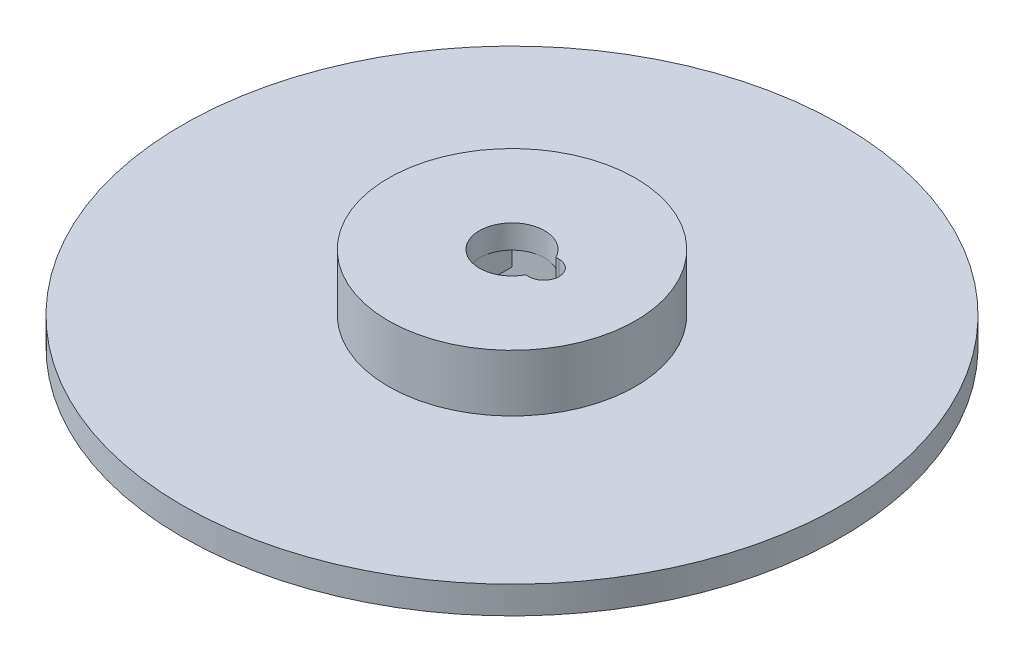
ISO-10303-21;
HEADER;
FILE_DESCRIPTION(('STEP AP214'),'2;1');
FILE_NAME('part.step','',(''),(''),'','','');
FILE_SCHEMA(('AUTOMOTIVE_DESIGN { 1 0 10303 214 1 1 1 1 }'));
ENDSEC;
DATA;
#1=APPLICATION_CONTEXT('core data for automotive mechanical design processes');
#2=APPLICATION_PROTOCOL_DEFINITION('international standard','automotive_design',2000,#1);
#3=PRODUCT_CONTEXT('',#1,'mechanical');
#4=PRODUCT('Part','Part','',(#3));
#5=PRODUCT_RELATED_PRODUCT_CATEGORY('part','',(#4));
#6=PRODUCT_DEFINITION_FORMATION('','',#4);
#7=PRODUCT_DEFINITION_CONTEXT('part definition',#1,'design');
#8=PRODUCT_DEFINITION('design','',#6,#7);
#9=PRODUCT_DEFINITION_SHAPE('','',#8);
#10=(LENGTH_UNIT() NAMED_UNIT(*) SI_UNIT(.MILLI.,.METRE.));
#11=(NAMED_UNIT(*) PLANE_ANGLE_UNIT() SI_UNIT($,.RADIAN.));
#12=(NAMED_UNIT(*) SI_UNIT($,.STERADIAN.) SOLID_ANGLE_UNIT());
#13=UNCERTAINTY_MEASURE_WITH_UNIT(LENGTH_MEASURE(1.E-05),#10,'distance_accuracy_value','');
#14=(GEOMETRIC_REPRESENTATION_CONTEXT(3) GLOBAL_UNCERTAINTY_ASSIGNED_CONTEXT((#13)) GLOBAL_UNIT_ASSIGNED_CONTEXT((#10,
#11,#12)) REPRESENTATION_CONTEXT('',''));
#15=CARTESIAN_POINT('',(0.,0.,0.));
#16=DIRECTION('',(0.,0.,1.));
#17=DIRECTION('',(1.,0.,0.));
#18=AXIS2_PLACEMENT_3D('',#15,#16,#17);
#19=CARTESIAN_POINT('',(0.,0.,0.));
#20=DIRECTION('',(0.,1.,0.));
#21=DIRECTION('',(0.,0.,1.));
#22=AXIS2_PLACEMENT_3D('',#19,#20,#21);
#23=PLANE('',#22);
#24=CARTESIAN_POINT('',(0.,0.,0.));
#25=DIRECTION('',(0.,1.,0.));
#26=DIRECTION('',(0.,0.,1.));
#27=AXIS2_PLACEMENT_3D('',#24,#25,#26);
#28=CIRCLE('',#27,60.);
#29=CARTESIAN_POINT('',(0.,0.,60.));
#30=VERTEX_POINT('',#29);
#31=EDGE_CURVE('E233',#30,#30,#28,.T.);
#32=ORIENTED_EDGE('',*,*,#31,.F.);
#33=EDGE_LOOP('',(#32));
#34=FACE_BOUND('',#33,.T.);
#35=DIRECTION('',(1.,0.,0.));
#36=VECTOR('',#35,1.);
#37=CARTESIAN_POINT('',(-10.73,0.,-5.925));
#38=LINE('',#37,#36);
#39=CARTESIAN_POINT('',(-10.73,0.,-5.925));
#40=VERTEX_POINT('',#39);
#41=CARTESIAN_POINT('',(21.37,0.,-5.925));
#42=VERTEX_POINT('',#41);
#43=EDGE_CURVE('E141',#40,#42,#38,.T.);
#44=ORIENTED_EDGE('',*,*,#43,.F.);
#45=DIRECTION('',(0.,0.,1.));
#46=VECTOR('',#45,1.);
#47=CARTESIAN_POINT('',(-10.73,0.,-5.925));
#48=LINE('',#47,#46);
#49=CARTESIAN_POINT('',(-10.73,0.,5.925));
#50=VERTEX_POINT('',#49);
#51=EDGE_CURVE('E166',#40,#50,#48,.T.);
#52=ORIENTED_EDGE('',*,*,#51,.T.);
#53=DIRECTION('',(1.,0.,0.));
#54=VECTOR('',#53,1.);
#55=CARTESIAN_POINT('',(-10.73,0.,5.925));
#56=LINE('',#55,#54);
#57=CARTESIAN_POINT('',(21.37,0.,5.925));
#58=VERTEX_POINT('',#57);
#59=EDGE_CURVE('E51',#50,#58,#56,.T.);
#60=ORIENTED_EDGE('',*,*,#59,.T.);
#61=DIRECTION('',(0.,0.,1.));
#62=VECTOR('',#61,1.);
#63=CARTESIAN_POINT('',(21.37,0.,-5.925));
#64=LINE('',#63,#62);
#65=EDGE_CURVE('E153',#42,#58,#64,.T.);
#66=ORIENTED_EDGE('',*,*,#65,.F.);
#67=EDGE_LOOP('',(#44,#52,#60,#66));
#68=FACE_BOUND('',#67,.T.);
#69=ADVANCED_FACE('F33',(#34,#68),#23,.F.);
#70=CARTESIAN_POINT('',(0.,16.7,0.));
#71=DIRECTION('',(0.,-1.,0.));
#72=DIRECTION('',(0.,0.,-1.));
#73=AXIS2_PLACEMENT_3D('',#70,#71,#72);
#74=CYLINDRICAL_SURFACE('',#73,22.5);
#75=CARTESIAN_POINT('',(0.,5.,0.));
#76=DIRECTION('',(0.,1.,0.));
#77=DIRECTION('',(0.,0.,1.));
#78=AXIS2_PLACEMENT_3D('',#75,#76,#77);
#79=CIRCLE('',#78,22.5);
#80=CARTESIAN_POINT('',(0.,5.,22.5));
#81=VERTEX_POINT('',#80);
#82=EDGE_CURVE('E234',#81,#81,#79,.T.);
#83=ORIENTED_EDGE('',*,*,#82,.T.);
#84=EDGE_LOOP('',(#83));
#85=FACE_BOUND('',#84,.T.);
#86=CARTESIAN_POINT('',(0.,15.36,0.));
#87=DIRECTION('',(0.,1.,0.));
#88=DIRECTION('',(0.,0.,1.));
#89=AXIS2_PLACEMENT_3D('',#86,#87,#88);
#90=CIRCLE('',#89,22.5);
#91=CARTESIAN_POINT('',(0.,15.36,22.5));
#92=VERTEX_POINT('',#91);
#93=EDGE_CURVE('E224',#92,#92,#90,.T.);
#94=ORIENTED_EDGE('',*,*,#93,.F.);
#95=EDGE_LOOP('',(#94));
#96=FACE_BOUND('',#95,.T.);
#97=ADVANCED_FACE('F289',(#85,#96),#74,.T.);
#98=CARTESIAN_POINT('',(0.,5.,0.));
#99=DIRECTION('',(0.,-1.,0.));
#100=DIRECTION('',(0.,0.,-1.));
#101=AXIS2_PLACEMENT_3D('',#98,#99,#100);
#102=CYLINDRICAL_SURFACE('',#101,60.);
#103=CARTESIAN_POINT('',(0.,5.,0.));
#104=DIRECTION('',(0.,1.,0.));
#105=DIRECTION('',(0.,0.,1.));
#106=AXIS2_PLACEMENT_3D('',#103,#104,#105);
#107=CIRCLE('',#106,60.);
#108=CARTESIAN_POINT('',(0.,5.,60.));
#109=VERTEX_POINT('',#108);
#110=EDGE_CURVE('E237',#109,#109,#107,.T.);
#111=ORIENTED_EDGE('',*,*,#110,.F.);
#112=EDGE_LOOP('',(#111));
#113=FACE_BOUND('',#112,.T.);
#114=ORIENTED_EDGE('',*,*,#31,.T.);
#115=EDGE_LOOP('',(#114));
#116=FACE_BOUND('',#115,.T.);
#117=ADVANCED_FACE('F35',(#113,#116),#102,.T.);
#118=CARTESIAN_POINT('',(0.,5.,0.));
#119=DIRECTION('',(0.,1.,0.));
#120=DIRECTION('',(0.,0.,1.));
#121=AXIS2_PLACEMENT_3D('',#118,#119,#120);
#122=PLANE('',#121);
#123=ORIENTED_EDGE('',*,*,#82,.F.);
#124=EDGE_LOOP('',(#123));
#125=FACE_BOUND('',#124,.T.);
#126=ORIENTED_EDGE('',*,*,#110,.T.);
#127=EDGE_LOOP('',(#126));
#128=FACE_BOUND('',#127,.T.);
#129=ADVANCED_FACE('F287',(#125,#128),#122,.T.);
#130=CARTESIAN_POINT('',(0.,15.36,0.));
#131=DIRECTION('',(0.,1.,0.));
#132=DIRECTION('',(0.,0.,1.));
#133=AXIS2_PLACEMENT_3D('',#130,#131,#132);
#134=PLANE('',#133);
#135=CARTESIAN_POINT('',(5.82,15.36,0.));
#136=DIRECTION('',(0.,1.,0.));
#137=DIRECTION('',(0.,0.,1.));
#138=AXIS2_PLACEMENT_3D('',#135,#136,#137);
#139=CIRCLE('',#138,2.75);
#140=CARTESIAN_POINT('',(5.82,15.36,2.75));
#141=VERTEX_POINT('',#140);
#142=CARTESIAN_POINT('',(5.82,15.36,-2.75));
#143=VERTEX_POINT('',#142);
#144=EDGE_CURVE('E211',#141,#143,#139,.T.);
#145=ORIENTED_EDGE('',*,*,#144,.F.);
#146=DIRECTION('',(1.,0.,0.));
#147=VECTOR('',#146,1.);
#148=CARTESIAN_POINT('',(5.25379862575642,15.36,2.75));
#149=LINE('',#148,#147);
#150=CARTESIAN_POINT('',(5.25379862575642,15.36,2.75));
#151=VERTEX_POINT('',#150);
#152=EDGE_CURVE('E204',#151,#141,#149,.T.);
#153=ORIENTED_EDGE('',*,*,#152,.F.);
#154=CARTESIAN_POINT('',(0.,15.36,0.));
#155=DIRECTION('',(0.,1.,0.));
#156=DIRECTION('',(0.,0.,1.));
#157=AXIS2_PLACEMENT_3D('',#154,#155,#156);
#158=CIRCLE('',#157,5.93);
#159=CARTESIAN_POINT('',(5.25379862575642,15.36,-2.75));
#160=VERTEX_POINT('',#159);
#161=EDGE_CURVE('E217',#160,#151,#158,.T.);
#162=ORIENTED_EDGE('',*,*,#161,.F.);
#163=DIRECTION('',(-1.,0.,0.));
#164=VECTOR('',#163,1.);
#165=CARTESIAN_POINT('',(5.25379862575642,15.36,-2.75));
#166=LINE('',#165,#164);
#167=EDGE_CURVE('E213',#143,#160,#166,.T.);
#168=ORIENTED_EDGE('',*,*,#167,.F.);
#169=EDGE_LOOP('',(#145,#153,#162,#168));
#170=FACE_BOUND('',#169,.T.);
#171=ORIENTED_EDGE('',*,*,#93,.T.);
#172=EDGE_LOOP('',(#171));
#173=FACE_BOUND('',#172,.T.);
#174=ADVANCED_FACE('F283',(#170,#173),#134,.T.);
#175=CARTESIAN_POINT('',(5.82,11.06,0.));
#176=DIRECTION('',(0.,1.,0.));
#177=DIRECTION('',(0.,0.,1.));
#178=AXIS2_PLACEMENT_3D('',#175,#176,#177);
#179=CYLINDRICAL_SURFACE('',#178,2.75);
#180=ORIENTED_EDGE('',*,*,#144,.T.);
#181=DIRECTION('',(0.,1.,0.));
#182=VECTOR('',#181,1.);
#183=CARTESIAN_POINT('',(5.82,11.06,-2.75));
#184=LINE('',#183,#182);
#185=CARTESIAN_POINT('',(5.82,11.06,-2.75));
#186=VERTEX_POINT('',#185);
#187=EDGE_CURVE('E209',#186,#143,#184,.T.);
#188=ORIENTED_EDGE('',*,*,#187,.F.);
#189=CARTESIAN_POINT('',(5.82,11.06,0.));
#190=DIRECTION('',(0.,1.,0.));
#191=DIRECTION('',(0.,0.,1.));
#192=AXIS2_PLACEMENT_3D('',#189,#190,#191);
#193=CIRCLE('',#192,2.75);
#194=CARTESIAN_POINT('',(5.82,11.06,2.75));
#195=VERTEX_POINT('',#194);
#196=EDGE_CURVE('E201',#195,#186,#193,.T.);
#197=ORIENTED_EDGE('',*,*,#196,.F.);
#198=DIRECTION('',(0.,1.,0.));
#199=VECTOR('',#198,1.);
#200=CARTESIAN_POINT('',(5.82,11.06,2.75));
#201=LINE('',#200,#199);
#202=EDGE_CURVE('E222',#195,#141,#201,.T.);
#203=ORIENTED_EDGE('',*,*,#202,.T.);
#204=EDGE_LOOP('',(#180,#188,#197,#203));
#205=FACE_BOUND('',#204,.T.);
#206=ADVANCED_FACE('F280',(#205),#179,.F.);
#207=CARTESIAN_POINT('',(5.25379862575642,11.06,2.75));
#208=DIRECTION('',(0.,0.,1.));
#209=DIRECTION('',(1.,0.,0.));
#210=AXIS2_PLACEMENT_3D('',#207,#208,#209);
#211=PLANE('',#210);
#212=ORIENTED_EDGE('',*,*,#152,.T.);
#213=ORIENTED_EDGE('',*,*,#202,.F.);
#214=DIRECTION('',(1.,0.,0.));
#215=VECTOR('',#214,1.);
#216=CARTESIAN_POINT('',(5.25379862575642,11.06,2.75));
#217=LINE('',#216,#215);
#218=CARTESIAN_POINT('',(5.25379862575642,11.06,2.75));
#219=VERTEX_POINT('',#218);
#220=EDGE_CURVE('E207',#219,#195,#217,.T.);
#221=ORIENTED_EDGE('',*,*,#220,.F.);
#222=DIRECTION('',(0.,1.,0.));
#223=VECTOR('',#222,1.);
#224=CARTESIAN_POINT('',(5.25379862575642,11.06,2.75));
#225=LINE('',#224,#223);
#226=EDGE_CURVE('E225',#219,#151,#225,.T.);
#227=ORIENTED_EDGE('',*,*,#226,.T.);
#228=EDGE_LOOP('',(#212,#213,#221,#227));
#229=FACE_BOUND('',#228,.T.);
#230=ADVANCED_FACE('F272',(#229),#211,.F.);
#231=CARTESIAN_POINT('',(0.,11.06,0.));
#232=DIRECTION('',(0.,1.,0.));
#233=DIRECTION('',(0.,0.,1.));
#234=AXIS2_PLACEMENT_3D('',#231,#232,#233);
#235=CYLINDRICAL_SURFACE('',#234,5.93);
#236=ORIENTED_EDGE('',*,*,#161,.T.);
#237=ORIENTED_EDGE('',*,*,#226,.F.);
#238=CARTESIAN_POINT('',(0.,11.06,0.));
#239=DIRECTION('',(0.,1.,0.));
#240=DIRECTION('',(0.,0.,1.));
#241=AXIS2_PLACEMENT_3D('',#238,#239,#240);
#242=CIRCLE('',#241,5.93);
#243=CARTESIAN_POINT('',(0.243464576478782,11.06,5.925));
#244=VERTEX_POINT('',#243);
#245=EDGE_CURVE('E206',#244,#219,#242,.T.);
#246=ORIENTED_EDGE('',*,*,#245,.F.);
#247=CARTESIAN_POINT('',(-0.243464576478782,11.06,5.925));
#248=DIRECTION('',(1.,0.,0.));
#249=VECTOR('',#248,1.);
#250=LINE('',#247,#249);
#251=CARTESIAN_POINT('',(-0.243464576478782,11.06,5.925));
#252=VERTEX_POINT('',#251);
#253=EDGE_CURVE('E44',#252,#244,#250,.T.);
#254=ORIENTED_EDGE('',*,*,#253,.F.);
#255=CARTESIAN_POINT('',(-5.93,11.06,0.));
#256=VERTEX_POINT('',#255);
#257=EDGE_CURVE('E242',#256,#252,#242,.T.);
#258=ORIENTED_EDGE('',*,*,#257,.F.);
#259=CARTESIAN_POINT('',(-0.243464576478782,11.06,-5.925));
#260=VERTEX_POINT('',#259);
#261=EDGE_CURVE('E245',#260,#256,#242,.T.);
#262=ORIENTED_EDGE('',*,*,#261,.F.);
#263=CARTESIAN_POINT('',(0.243464576478782,11.06,-5.925));
#264=DIRECTION('',(-1.,0.,0.));
#265=VECTOR('',#264,1.);
#266=LINE('',#263,#265);
#267=CARTESIAN_POINT('',(0.243464576478782,11.06,-5.925));
#268=VERTEX_POINT('',#267);
#269=EDGE_CURVE('E11',#268,#260,#266,.T.);
#270=ORIENTED_EDGE('',*,*,#269,.F.);
#271=CARTESIAN_POINT('',(5.25379862575642,11.06,-2.75));
#272=VERTEX_POINT('',#271);
#273=EDGE_CURVE('E210',#272,#268,#242,.T.);
#274=ORIENTED_EDGE('',*,*,#273,.F.);
#275=DIRECTION('',(0.,1.,0.));
#276=VECTOR('',#275,1.);
#277=CARTESIAN_POINT('',(5.25379862575642,11.06,-2.75));
#278=LINE('',#277,#276);
#279=EDGE_CURVE('E227',#272,#160,#278,.T.);
#280=ORIENTED_EDGE('',*,*,#279,.T.);
#281=EDGE_LOOP('',(#236,#237,#246,#254,#258,#262,#270,#274,#280));
#282=FACE_BOUND('',#281,.T.);
#283=ADVANCED_FACE('F261',(#282),#235,.F.);
#284=CARTESIAN_POINT('',(5.25379862575642,11.06,-2.75));
#285=DIRECTION('',(0.,0.,-1.));
#286=DIRECTION('',(-1.,0.,0.));
#287=AXIS2_PLACEMENT_3D('',#284,#285,#286);
#288=PLANE('',#287);
#289=ORIENTED_EDGE('',*,*,#167,.T.);
#290=ORIENTED_EDGE('',*,*,#279,.F.);
#291=DIRECTION('',(-1.,0.,0.));
#292=VECTOR('',#291,1.);
#293=CARTESIAN_POINT('',(5.25379862575642,11.06,-2.75));
#294=LINE('',#293,#292);
#295=EDGE_CURVE('E203',#186,#272,#294,.T.);
#296=ORIENTED_EDGE('',*,*,#295,.F.);
#297=ORIENTED_EDGE('',*,*,#187,.T.);
#298=EDGE_LOOP('',(#289,#290,#296,#297));
#299=FACE_BOUND('',#298,.T.);
#300=ADVANCED_FACE('F271',(#299),#288,.F.);
#301=CARTESIAN_POINT('',(0.,11.06,0.));
#302=DIRECTION('',(0.,1.,0.));
#303=DIRECTION('',(0.,0.,1.));
#304=AXIS2_PLACEMENT_3D('',#301,#302,#303);
#305=PLANE('',#304);
#306=ORIENTED_EDGE('',*,*,#261,.T.);
#307=DIRECTION('',(0.,0.,1.));
#308=VECTOR('',#307,1.);
#309=CARTESIAN_POINT('',(-5.93,11.06,0.));
#310=LINE('',#309,#308);
#311=CARTESIAN_POINT('',(-5.93,11.06,-5.925));
#312=VERTEX_POINT('',#311);
#313=EDGE_CURVE('E193',#312,#256,#310,.T.);
#314=ORIENTED_EDGE('',*,*,#313,.F.);
#315=DIRECTION('',(1.,0.,0.));
#316=VECTOR('',#315,1.);
#317=CARTESIAN_POINT('',(0.,11.06,-5.925));
#318=LINE('',#317,#316);
#319=EDGE_CURVE('E197',#312,#260,#318,.T.);
#320=ORIENTED_EDGE('',*,*,#319,.T.);
#321=EDGE_LOOP('',(#306,#314,#320));
#322=FACE_BOUND('',#321,.T.);
#323=ADVANCED_FACE('F278',(#322),#305,.F.);
#324=ORIENTED_EDGE('',*,*,#257,.T.);
#325=DIRECTION('',(1.,0.,0.));
#326=VECTOR('',#325,1.);
#327=CARTESIAN_POINT('',(0.,11.06,5.925));
#328=LINE('',#327,#326);
#329=CARTESIAN_POINT('',(-5.93,11.06,5.925));
#330=VERTEX_POINT('',#329);
#331=EDGE_CURVE('E58',#330,#252,#328,.T.);
#332=ORIENTED_EDGE('',*,*,#331,.F.);
#333=EDGE_CURVE('E517',#256,#330,#310,.T.);
#334=ORIENTED_EDGE('',*,*,#333,.F.);
#335=EDGE_LOOP('',(#324,#332,#334));
#336=FACE_BOUND('',#335,.T.);
#337=ADVANCED_FACE('F352',(#336),#305,.F.);
#338=CARTESIAN_POINT('',(0.,6.66,-5.925));
#339=DIRECTION('',(0.,0.,1.));
#340=DIRECTION('',(1.,0.,0.));
#341=AXIS2_PLACEMENT_3D('',#338,#339,#340);
#342=PLANE('',#341);
#343=ORIENTED_EDGE('',*,*,#319,.F.);
#344=DIRECTION('',(0.,1.,0.));
#345=VECTOR('',#344,1.);
#346=CARTESIAN_POINT('',(-5.93,6.66,-5.925));
#347=LINE('',#346,#345);
#348=CARTESIAN_POINT('',(-5.93,6.66,-5.925));
#349=VERTEX_POINT('',#348);
#350=EDGE_CURVE('E190',#349,#312,#347,.T.);
#351=ORIENTED_EDGE('',*,*,#350,.F.);
#352=DIRECTION('',(1.,0.,0.));
#353=VECTOR('',#352,1.);
#354=CARTESIAN_POINT('',(-10.73,6.66,-5.925));
#355=LINE('',#354,#353);
#356=CARTESIAN_POINT('',(-10.73,6.66,-5.925));
#357=VERTEX_POINT('',#356);
#358=EDGE_CURVE('E170',#357,#349,#355,.T.);
#359=ORIENTED_EDGE('',*,*,#358,.F.);
#360=DIRECTION('',(0.,1.,0.));
#361=VECTOR('',#360,1.);
#362=CARTESIAN_POINT('',(-10.73,0.,-5.925));
#363=LINE('',#362,#361);
#364=EDGE_CURVE('E148',#40,#357,#363,.T.);
#365=ORIENTED_EDGE('',*,*,#364,.F.);
#366=ORIENTED_EDGE('',*,*,#43,.T.);
#367=DIRECTION('',(0.,1.,0.));
#368=VECTOR('',#367,1.);
#369=CARTESIAN_POINT('',(21.37,0.,-5.925));
#370=LINE('',#369,#368);
#371=CARTESIAN_POINT('',(21.37,6.66,-5.925));
#372=VERTEX_POINT('',#371);
#373=EDGE_CURVE('E146',#42,#372,#370,.T.);
#374=ORIENTED_EDGE('',*,*,#373,.T.);
#375=CARTESIAN_POINT('',(16.87,6.66,-5.925));
#376=VERTEX_POINT('',#375);
#377=EDGE_CURVE('E172',#376,#372,#355,.T.);
#378=ORIENTED_EDGE('',*,*,#377,.F.);
#379=DIRECTION('',(0.,1.,0.));
#380=VECTOR('',#379,1.);
#381=CARTESIAN_POINT('',(16.87,6.66,-5.925));
#382=LINE('',#381,#380);
#383=CARTESIAN_POINT('',(16.87,11.06,-5.925));
#384=VERTEX_POINT('',#383);
#385=EDGE_CURVE('E214',#376,#384,#382,.T.);
#386=ORIENTED_EDGE('',*,*,#385,.T.);
#387=EDGE_CURVE('E162',#268,#384,#318,.T.);
#388=ORIENTED_EDGE('',*,*,#387,.F.);
#389=ORIENTED_EDGE('',*,*,#269,.T.);
#390=EDGE_LOOP('',(#343,#351,#359,#365,#366,#374,#378,#386,#388,#389));
#391=FACE_BOUND('',#390,.T.);
#392=ADVANCED_FACE('F144',(#391),#342,.T.);
#393=CARTESIAN_POINT('',(16.87,6.66,0.));
#394=DIRECTION('',(-1.,0.,0.));
#395=DIRECTION('',(0.,0.,1.));
#396=AXIS2_PLACEMENT_3D('',#393,#394,#395);
#397=PLANE('',#396);
#398=DIRECTION('',(0.,0.,1.));
#399=VECTOR('',#398,1.);
#400=CARTESIAN_POINT('',(16.87,11.06,0.));
#401=LINE('',#400,#399);
#402=CARTESIAN_POINT('',(16.87,11.06,5.925));
#403=VERTEX_POINT('',#402);
#404=EDGE_CURVE('E187',#384,#403,#401,.T.);
#405=ORIENTED_EDGE('',*,*,#404,.F.);
#406=ORIENTED_EDGE('',*,*,#385,.F.);
#407=DIRECTION('',(0.,0.,1.));
#408=VECTOR('',#407,1.);
#409=CARTESIAN_POINT('',(16.87,6.66,0.));
#410=LINE('',#409,#408);
#411=CARTESIAN_POINT('',(16.87,6.66,5.925));
#412=VERTEX_POINT('',#411);
#413=EDGE_CURVE('E186',#376,#412,#410,.T.);
#414=ORIENTED_EDGE('',*,*,#413,.T.);
#415=DIRECTION('',(0.,1.,0.));
#416=VECTOR('',#415,1.);
#417=CARTESIAN_POINT('',(16.87,6.66,5.925));
#418=LINE('',#417,#416);
#419=EDGE_CURVE('E503',#412,#403,#418,.T.);
#420=ORIENTED_EDGE('',*,*,#419,.T.);
#421=EDGE_LOOP('',(#405,#406,#414,#420));
#422=FACE_BOUND('',#421,.T.);
#423=ADVANCED_FACE('F366',(#422),#397,.T.);
#424=CARTESIAN_POINT('',(0.,6.66,5.925));
#425=DIRECTION('',(0.,0.,1.));
#426=DIRECTION('',(1.,0.,0.));
#427=AXIS2_PLACEMENT_3D('',#424,#425,#426);
#428=PLANE('',#427);
#429=ORIENTED_EDGE('',*,*,#331,.T.);
#430=ORIENTED_EDGE('',*,*,#253,.T.);
#431=EDGE_CURVE('E250',#244,#403,#328,.T.);
#432=ORIENTED_EDGE('',*,*,#431,.T.);
#433=ORIENTED_EDGE('',*,*,#419,.F.);
#434=DIRECTION('',(1.,0.,0.));
#435=VECTOR('',#434,1.);
#436=CARTESIAN_POINT('',(-10.73,6.66,5.925));
#437=LINE('',#436,#435);
#438=CARTESIAN_POINT('',(21.37,6.66,5.925));
#439=VERTEX_POINT('',#438);
#440=EDGE_CURVE('E174',#412,#439,#437,.T.);
#441=ORIENTED_EDGE('',*,*,#440,.T.);
#442=DIRECTION('',(0.,1.,0.));
#443=VECTOR('',#442,1.);
#444=CARTESIAN_POINT('',(21.37,0.,5.925));
#445=LINE('',#444,#443);
#446=EDGE_CURVE('E163',#58,#439,#445,.T.);
#447=ORIENTED_EDGE('',*,*,#446,.F.);
#448=ORIENTED_EDGE('',*,*,#59,.F.);
#449=DIRECTION('',(0.,1.,0.));
#450=VECTOR('',#449,1.);
#451=CARTESIAN_POINT('',(-10.73,0.,5.925));
#452=LINE('',#451,#450);
#453=CARTESIAN_POINT('',(-10.73,6.66,5.925));
#454=VERTEX_POINT('',#453);
#455=EDGE_CURVE('E181',#50,#454,#452,.T.);
#456=ORIENTED_EDGE('',*,*,#455,.T.);
#457=CARTESIAN_POINT('',(-5.93,6.66,5.925));
#458=VERTEX_POINT('',#457);
#459=EDGE_CURVE('E175',#454,#458,#437,.T.);
#460=ORIENTED_EDGE('',*,*,#459,.T.);
#461=DIRECTION('',(0.,1.,0.));
#462=VECTOR('',#461,1.);
#463=CARTESIAN_POINT('',(-5.93,6.66,5.925));
#464=LINE('',#463,#462);
#465=EDGE_CURVE('E506',#458,#330,#464,.T.);
#466=ORIENTED_EDGE('',*,*,#465,.T.);
#467=EDGE_LOOP('',(#429,#430,#432,#433,#441,#447,#448,#456,#460,#466));
#468=FACE_BOUND('',#467,.T.);
#469=ADVANCED_FACE('F371',(#468),#428,.F.);
#470=CARTESIAN_POINT('',(-5.93,6.66,0.));
#471=DIRECTION('',(-1.,0.,0.));
#472=DIRECTION('',(0.,0.,1.));
#473=AXIS2_PLACEMENT_3D('',#470,#471,#472);
#474=PLANE('',#473);
#475=ORIENTED_EDGE('',*,*,#313,.T.);
#476=ORIENTED_EDGE('',*,*,#333,.T.);
#477=ORIENTED_EDGE('',*,*,#465,.F.);
#478=DIRECTION('',(0.,0.,1.));
#479=VECTOR('',#478,1.);
#480=CARTESIAN_POINT('',(-5.93,6.66,0.));
#481=LINE('',#480,#479);
#482=EDGE_CURVE('E184',#349,#458,#481,.T.);
#483=ORIENTED_EDGE('',*,*,#482,.F.);
#484=ORIENTED_EDGE('',*,*,#350,.T.);
#485=EDGE_LOOP('',(#475,#476,#477,#483,#484));
#486=FACE_BOUND('',#485,.T.);
#487=ADVANCED_FACE('F379',(#486),#474,.F.);
#488=ORIENTED_EDGE('',*,*,#273,.T.);
#489=ORIENTED_EDGE('',*,*,#387,.T.);
#490=ORIENTED_EDGE('',*,*,#404,.T.);
#491=ORIENTED_EDGE('',*,*,#431,.F.);
#492=ORIENTED_EDGE('',*,*,#245,.T.);
#493=ORIENTED_EDGE('',*,*,#220,.T.);
#494=ORIENTED_EDGE('',*,*,#196,.T.);
#495=ORIENTED_EDGE('',*,*,#295,.T.);
#496=EDGE_LOOP('',(#488,#489,#490,#491,#492,#493,#494,#495));
#497=FACE_BOUND('',#496,.T.);
#498=ADVANCED_FACE('F355',(#497),#305,.F.);
#499=CARTESIAN_POINT('',(0.,6.66,0.));
#500=DIRECTION('',(0.,-1.,0.));
#501=DIRECTION('',(0.,0.,-1.));
#502=AXIS2_PLACEMENT_3D('',#499,#500,#501);
#503=PLANE('',#502);
#504=ORIENTED_EDGE('',*,*,#482,.T.);
#505=ORIENTED_EDGE('',*,*,#459,.F.);
#506=DIRECTION('',(0.,0.,1.));
#507=VECTOR('',#506,1.);
#508=CARTESIAN_POINT('',(-10.73,6.66,-5.925));
#509=LINE('',#508,#507);
#510=EDGE_CURVE('E154',#357,#454,#509,.T.);
#511=ORIENTED_EDGE('',*,*,#510,.F.);
#512=ORIENTED_EDGE('',*,*,#358,.T.);
#513=EDGE_LOOP('',(#504,#505,#511,#512));
#514=FACE_BOUND('',#513,.T.);
#515=ADVANCED_FACE('F393',(#514),#503,.T.);
#516=CARTESIAN_POINT('',(21.37,0.,-5.925));
#517=DIRECTION('',(-1.,0.,0.));
#518=DIRECTION('',(0.,0.,1.));
#519=AXIS2_PLACEMENT_3D('',#516,#517,#518);
#520=PLANE('',#519);
#521=DIRECTION('',(0.,0.,1.));
#522=VECTOR('',#521,1.);
#523=CARTESIAN_POINT('',(21.37,6.66,-5.925));
#524=LINE('',#523,#522);
#525=EDGE_CURVE('E161',#372,#439,#524,.T.);
#526=ORIENTED_EDGE('',*,*,#525,.F.);
#527=ORIENTED_EDGE('',*,*,#373,.F.);
#528=ORIENTED_EDGE('',*,*,#65,.T.);
#529=ORIENTED_EDGE('',*,*,#446,.T.);
#530=EDGE_LOOP('',(#526,#527,#528,#529));
#531=FACE_BOUND('',#530,.T.);
#532=ADVANCED_FACE('F158',(#531),#520,.T.);
#533=CARTESIAN_POINT('',(-10.73,0.,-5.925));
#534=DIRECTION('',(-1.,0.,0.));
#535=DIRECTION('',(0.,0.,1.));
#536=AXIS2_PLACEMENT_3D('',#533,#534,#535);
#537=PLANE('',#536);
#538=ORIENTED_EDGE('',*,*,#510,.T.);
#539=ORIENTED_EDGE('',*,*,#455,.F.);
#540=ORIENTED_EDGE('',*,*,#51,.F.);
#541=ORIENTED_EDGE('',*,*,#364,.T.);
#542=EDGE_LOOP('',(#538,#539,#540,#541));
#543=FACE_BOUND('',#542,.T.);
#544=ADVANCED_FACE('F406',(#543),#537,.F.);
#545=ORIENTED_EDGE('',*,*,#377,.T.);
#546=ORIENTED_EDGE('',*,*,#525,.T.);
#547=ORIENTED_EDGE('',*,*,#440,.F.);
#548=ORIENTED_EDGE('',*,*,#413,.F.);
#549=EDGE_LOOP('',(#545,#546,#547,#548));
#550=FACE_BOUND('',#549,.T.);
#551=ADVANCED_FACE('F400',(#550),#503,.T.);
#552=CLOSED_SHELL('',(#69,#97,#117,#129,#174,#206,#230,#283,#300,#323,#337,#392,#423,#469,#487,
#498,#515,#532,#544,#551));
#553=MANIFOLD_SOLID_BREP('B2',#552);
#554=ADVANCED_BREP_SHAPE_REPRESENTATION('',(#18,#553),#14);
#555=SHAPE_DEFINITION_REPRESENTATION(#9,#554);
ENDSEC;
END-ISO-10303-21;
